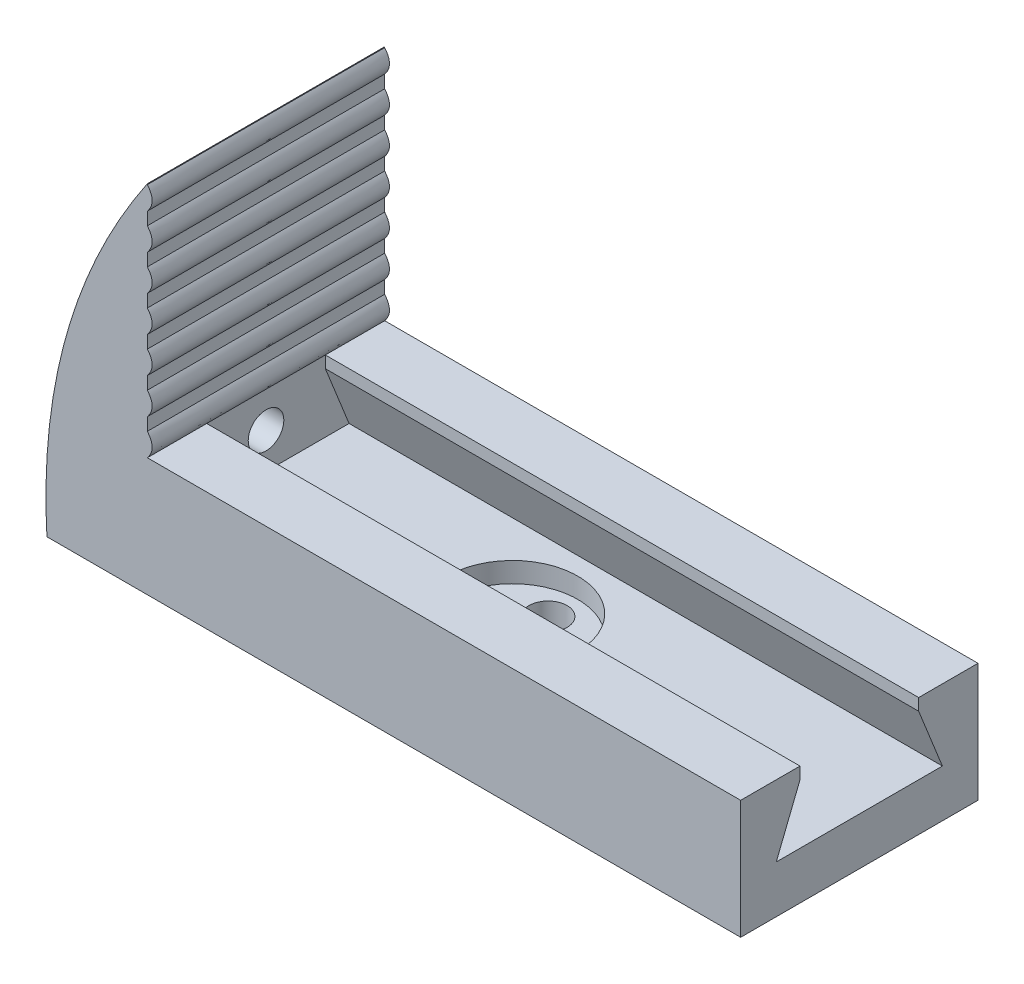
ISO-10303-21;
HEADER;
FILE_DESCRIPTION(('STEP AP214'),'2;1');
FILE_NAME('part.step','',(''),(''),'','','');
FILE_SCHEMA(('AUTOMOTIVE_DESIGN { 1 0 10303 214 1 1 1 1 }'));
ENDSEC;
DATA;
#1=APPLICATION_CONTEXT('core data for automotive mechanical design processes');
#2=APPLICATION_PROTOCOL_DEFINITION('international standard','automotive_design',2000,#1);
#3=PRODUCT_CONTEXT('',#1,'mechanical');
#4=PRODUCT('Part','Part','',(#3));
#5=PRODUCT_RELATED_PRODUCT_CATEGORY('part','',(#4));
#6=PRODUCT_DEFINITION_FORMATION('','',#4);
#7=PRODUCT_DEFINITION_CONTEXT('part definition',#1,'design');
#8=PRODUCT_DEFINITION('design','',#6,#7);
#9=PRODUCT_DEFINITION_SHAPE('','',#8);
#10=(LENGTH_UNIT() NAMED_UNIT(*) SI_UNIT(.MILLI.,.METRE.));
#11=(NAMED_UNIT(*) PLANE_ANGLE_UNIT() SI_UNIT($,.RADIAN.));
#12=(NAMED_UNIT(*) SI_UNIT($,.STERADIAN.) SOLID_ANGLE_UNIT());
#13=UNCERTAINTY_MEASURE_WITH_UNIT(LENGTH_MEASURE(1.E-05),#10,'distance_accuracy_value','');
#14=(GEOMETRIC_REPRESENTATION_CONTEXT(3) GLOBAL_UNCERTAINTY_ASSIGNED_CONTEXT((#13)) GLOBAL_UNIT_ASSIGNED_CONTEXT((#10,
#11,#12)) REPRESENTATION_CONTEXT('',''));
#15=CARTESIAN_POINT('',(0.,0.,0.));
#16=DIRECTION('',(0.,0.,1.));
#17=DIRECTION('',(1.,0.,0.));
#18=AXIS2_PLACEMENT_3D('',#15,#16,#17);
#19=CARTESIAN_POINT('',(-4.23156050298908,13.,3.));
#20=DIRECTION('',(0.,-1.,0.));
#21=DIRECTION('',(0.,0.,-1.));
#22=AXIS2_PLACEMENT_3D('',#19,#20,#21);
#23=CYLINDRICAL_SURFACE('',#22,1.6);
#24=CARTESIAN_POINT('',(-4.23156050298908,0.,3.));
#25=DIRECTION('',(0.,-1.,0.));
#26=DIRECTION('',(0.,0.,-1.));
#27=AXIS2_PLACEMENT_3D('',#24,#25,#26);
#28=CIRCLE('',#27,1.6);
#29=CARTESIAN_POINT('',(-4.23156050298908,0.,1.4));
#30=VERTEX_POINT('',#29);
#31=EDGE_CURVE('E319',#30,#30,#28,.T.);
#32=ORIENTED_EDGE('',*,*,#31,.T.);
#33=EDGE_LOOP('',(#32));
#34=FACE_BOUND('',#33,.T.);
#35=CARTESIAN_POINT('',(-4.23156050298908,2.3,3.));
#36=DIRECTION('',(0.,1.,0.));
#37=DIRECTION('',(0.,0.,1.));
#38=AXIS2_PLACEMENT_3D('',#35,#36,#37);
#39=CIRCLE('',#38,1.6);
#40=CARTESIAN_POINT('',(-4.23156050298908,2.3,4.6));
#41=VERTEX_POINT('',#40);
#42=EDGE_CURVE('E544',#41,#41,#39,.F.);
#43=ORIENTED_EDGE('',*,*,#42,.F.);
#44=EDGE_LOOP('',(#43));
#45=FACE_BOUND('',#44,.T.);
#46=ADVANCED_FACE('F37',(#34,#45),#23,.F.);
#47=CARTESIAN_POINT('',(-7.23156050298908,13.,0.));
#48=DIRECTION('',(0.,-1.,0.));
#49=DIRECTION('',(0.,0.,-1.));
#50=AXIS2_PLACEMENT_3D('',#47,#48,#49);
#51=CYLINDRICAL_SURFACE('',#50,1.6);
#52=CARTESIAN_POINT('',(-7.23156050298908,0.,0.));
#53=DIRECTION('',(0.,-1.,0.));
#54=DIRECTION('',(0.,0.,1.));
#55=AXIS2_PLACEMENT_3D('',#52,#53,#54);
#56=CIRCLE('',#55,1.6);
#57=CARTESIAN_POINT('',(-7.23156050298908,0.,1.6));
#58=VERTEX_POINT('',#57);
#59=EDGE_CURVE('E546',#58,#58,#56,.T.);
#60=ORIENTED_EDGE('',*,*,#59,.T.);
#61=EDGE_LOOP('',(#60));
#62=FACE_BOUND('',#61,.T.);
#63=CARTESIAN_POINT('',(-7.23156050298908,2.3,0.));
#64=DIRECTION('',(0.,1.,0.));
#65=DIRECTION('',(0.,0.,1.));
#66=AXIS2_PLACEMENT_3D('',#63,#64,#65);
#67=CIRCLE('',#66,1.6);
#68=CARTESIAN_POINT('',(-7.23156050298908,2.3,1.6));
#69=VERTEX_POINT('',#68);
#70=EDGE_CURVE('E547',#69,#69,#67,.F.);
#71=ORIENTED_EDGE('',*,*,#70,.F.);
#72=EDGE_LOOP('',(#71));
#73=FACE_BOUND('',#72,.T.);
#74=ADVANCED_FACE('F531',(#62,#73),#51,.F.);
#75=CARTESIAN_POINT('',(-4.23156050298908,13.,-3.00000000000001));
#76=DIRECTION('',(0.,-1.,0.));
#77=DIRECTION('',(0.,0.,-1.));
#78=AXIS2_PLACEMENT_3D('',#75,#76,#77);
#79=CYLINDRICAL_SURFACE('',#78,1.6);
#80=CARTESIAN_POINT('',(-4.23156050298908,0.,-3.00000000000001));
#81=DIRECTION('',(0.,-1.,0.));
#82=DIRECTION('',(0.,0.,1.));
#83=AXIS2_PLACEMENT_3D('',#80,#81,#82);
#84=CIRCLE('',#83,1.6);
#85=CARTESIAN_POINT('',(-4.23156050298908,0.,-1.40000000000001));
#86=VERTEX_POINT('',#85);
#87=EDGE_CURVE('E559',#86,#86,#84,.T.);
#88=ORIENTED_EDGE('',*,*,#87,.T.);
#89=EDGE_LOOP('',(#88));
#90=FACE_BOUND('',#89,.T.);
#91=CARTESIAN_POINT('',(-4.23156050298908,2.3,-3.00000000000001));
#92=DIRECTION('',(0.,1.,0.));
#93=DIRECTION('',(0.,0.,1.));
#94=AXIS2_PLACEMENT_3D('',#91,#92,#93);
#95=CIRCLE('',#94,1.6);
#96=CARTESIAN_POINT('',(-4.23156050298908,2.3,-1.40000000000001));
#97=VERTEX_POINT('',#96);
#98=EDGE_CURVE('E553',#97,#97,#95,.F.);
#99=ORIENTED_EDGE('',*,*,#98,.F.);
#100=EDGE_LOOP('',(#99));
#101=FACE_BOUND('',#100,.T.);
#102=ADVANCED_FACE('F536',(#90,#101),#79,.F.);
#103=CARTESIAN_POINT('',(-1.23156050298907,13.,0.));
#104=DIRECTION('',(0.,-1.,0.));
#105=DIRECTION('',(0.,0.,-1.));
#106=AXIS2_PLACEMENT_3D('',#103,#104,#105);
#107=CYLINDRICAL_SURFACE('',#106,1.6);
#108=CARTESIAN_POINT('',(-1.23156050298907,0.,0.));
#109=DIRECTION('',(0.,-1.,0.));
#110=DIRECTION('',(0.,0.,-1.));
#111=AXIS2_PLACEMENT_3D('',#108,#109,#110);
#112=CIRCLE('',#111,1.6);
#113=CARTESIAN_POINT('',(-1.23156050298907,0.,-1.6));
#114=VERTEX_POINT('',#113);
#115=EDGE_CURVE('E550',#114,#114,#112,.T.);
#116=ORIENTED_EDGE('',*,*,#115,.T.);
#117=EDGE_LOOP('',(#116));
#118=FACE_BOUND('',#117,.T.);
#119=CARTESIAN_POINT('',(-1.23156050298907,2.3,0.));
#120=DIRECTION('',(0.,1.,0.));
#121=DIRECTION('',(0.,0.,1.));
#122=AXIS2_PLACEMENT_3D('',#119,#120,#121);
#123=CIRCLE('',#122,1.6);
#124=CARTESIAN_POINT('',(-1.23156050298907,2.3,1.6));
#125=VERTEX_POINT('',#124);
#126=EDGE_CURVE('E41',#125,#125,#123,.F.);
#127=ORIENTED_EDGE('',*,*,#126,.F.);
#128=EDGE_LOOP('',(#127));
#129=FACE_BOUND('',#128,.T.);
#130=ADVANCED_FACE('F645',(#118,#129),#107,.F.);
#131=CARTESIAN_POINT('',(-25.,30.,-9.99999999999999));
#132=CARTESIAN_POINT('',(-34.3943093471857,16.1499442754286,-9.99999999999999));
#133=CARTESIAN_POINT('',(-33.4631210059781,0.,-9.99999999999999));
#134=B_SPLINE_CURVE_WITH_KNOTS('',2,(#131,#132,#133),.UNSPECIFIED.,.F.,.F.,(3,3),(0.,1.),.UNSPECIFIED.);
#135=DIRECTION('',(0.,0.,1.));
#136=VECTOR('',#135,1.);
#137=SURFACE_OF_LINEAR_EXTRUSION('',#134,#136);
#138=CARTESIAN_POINT('',(-25.,30.,10.));
#139=CARTESIAN_POINT('',(-34.3943093471857,16.1499442754286,10.));
#140=CARTESIAN_POINT('',(-33.4631210059781,0.,10.));
#141=B_SPLINE_CURVE_WITH_KNOTS('',2,(#138,#139,#140),.UNSPECIFIED.,.F.,.F.,(3,3),(0.,1.),.UNSPECIFIED.);
#142=CARTESIAN_POINT('',(-25.,30.,10.));
#143=VERTEX_POINT('',#142);
#144=CARTESIAN_POINT('',(-33.4631210059781,0.,10.));
#145=VERTEX_POINT('',#144);
#146=EDGE_CURVE('E225',#143,#145,#141,.T.);
#147=ORIENTED_EDGE('',*,*,#146,.F.);
#148=DIRECTION('',(0.,0.,1.));
#149=VECTOR('',#148,1.);
#150=CARTESIAN_POINT('',(-25.,30.,-9.99999999999999));
#151=LINE('',#150,#149);
#152=CARTESIAN_POINT('',(-25.,30.,-9.99999999999999));
#153=VERTEX_POINT('',#152);
#154=EDGE_CURVE('E244',#153,#143,#151,.T.);
#155=ORIENTED_EDGE('',*,*,#154,.F.);
#156=CARTESIAN_POINT('',(-33.4631210059781,0.,-9.99999999999999));
#157=VERTEX_POINT('',#156);
#158=EDGE_CURVE('E227',#153,#157,#134,.T.);
#159=ORIENTED_EDGE('',*,*,#158,.T.);
#160=DIRECTION('',(0.,0.,1.));
#161=VECTOR('',#160,1.);
#162=CARTESIAN_POINT('',(-33.4631210059781,0.,-9.99999999999999));
#163=LINE('',#162,#161);
#164=EDGE_CURVE('E237',#157,#145,#163,.T.);
#165=ORIENTED_EDGE('',*,*,#164,.T.);
#166=EDGE_LOOP('',(#147,#155,#159,#165));
#167=FACE_BOUND('',#166,.T.);
#168=CARTESIAN_POINT('',(-33.3726320097017,7.,1.5));
#169=CARTESIAN_POINT('',(-33.3798660882242,6.91568089328607,1.49999673038853));
#170=CARTESIAN_POINT('',(-33.3868757475341,6.83128390302348,1.49286722869916));
#171=CARTESIAN_POINT('',(-33.4002622270393,6.66477082808157,1.46450308822429));
#172=CARTESIAN_POINT('',(-33.4066383026797,6.58265750674469,1.44325207473375));
#173=CARTESIAN_POINT('',(-33.4186251285714,6.42314681296672,1.38722049220531));
#174=CARTESIAN_POINT('',(-33.4242361358155,6.34574786178663,1.35244448152408));
#175=CARTESIAN_POINT('',(-33.4346194485964,6.19788599730386,1.27033985265203));
#176=CARTESIAN_POINT('',(-33.4393919617546,6.12742136888278,1.22301434917541));
#177=CARTESIAN_POINT('',(-33.4480609090173,5.99557957848058,1.11725798364129));
#178=CARTESIAN_POINT('',(-33.451959234821,5.93418289421686,1.05885161606227));
#179=CARTESIAN_POINT('',(-33.4588961463163,5.82205945502125,0.932517662763153));
#180=CARTESIAN_POINT('',(-33.4619347090152,5.77133298545422,0.864589822481163));
#181=CARTESIAN_POINT('',(-33.4671688608163,5.6821147378301,0.721307884473805));
#182=CARTESIAN_POINT('',(-33.4693663155634,5.64359591529021,0.645970693711993));
#183=CARTESIAN_POINT('',(-33.4729572927952,5.57974513506824,0.489883644386686));
#184=CARTESIAN_POINT('',(-33.4743508221476,5.55441306473785,0.409133832067357));
#185=CARTESIAN_POINT('',(-33.476358002982,5.51768264134727,0.24460652431748));
#186=CARTESIAN_POINT('',(-33.4769724847515,5.50626945441649,0.160832350305014));
#187=CARTESIAN_POINT('',(-33.4774370863161,5.4976543683585,-0.00744545299836306));
#188=CARTESIAN_POINT('',(-33.4772872094699,5.50045240678101,-0.0919490790821164));
#189=CARTESIAN_POINT('',(-33.4762200592232,5.52017621021143,-0.259257644764204));
#190=CARTESIAN_POINT('',(-33.475303039982,5.5370972961569,-0.342063137657603));
#191=CARTESIAN_POINT('',(-33.4726836746026,5.58457647616954,-0.503654384382997));
#192=CARTESIAN_POINT('',(-33.4709813285049,5.6151345695341,-0.582440138422096));
#193=CARTESIAN_POINT('',(-33.466763172182,5.68901775292015,-0.733768545490131));
#194=CARTESIAN_POINT('',(-33.4642472485734,5.73234462237442,-0.80631032654891));
#195=CARTESIAN_POINT('',(-33.4583738812554,5.8305225920919,-0.943084936299633));
#196=CARTESIAN_POINT('',(-33.4550164370223,5.88537369952626,-1.00731775982115));
#197=CARTESIAN_POINT('',(-33.4474407136605,6.00507465187854,-1.12570634827153));
#198=CARTESIAN_POINT('',(-33.4432218032095,6.06993182113156,-1.17985466684207));
#199=CARTESIAN_POINT('',(-33.4339326800107,6.20776058791227,-1.27649558549115));
#200=CARTESIAN_POINT('',(-33.4288624615904,6.28073223950793,-1.31898810789891));
#201=CARTESIAN_POINT('',(-33.4179057591771,6.43284348482133,-1.39119871303511));
#202=CARTESIAN_POINT('',(-33.4120178675518,6.51199360968137,-1.42089439620854));
#203=CARTESIAN_POINT('',(-33.3995237628833,6.67409904972966,-1.46658804372891));
#204=CARTESIAN_POINT('',(-33.3929175387775,6.7570544235088,-1.4825857970889));
#205=CARTESIAN_POINT('',(-33.3791098900178,6.9246680882463,-1.50048300860634));
#206=CARTESIAN_POINT('',(-33.371906796951,7.00933061537866,-1.50234150094363));
#207=CARTESIAN_POINT('',(-33.3571194314144,7.17773293324932,-1.49182069052032));
#208=CARTESIAN_POINT('',(-33.3495351510483,7.26147270482885,-1.4794410927006));
#209=CARTESIAN_POINT('',(-33.3342079812667,7.42592392140654,-1.44074485052071));
#210=CARTESIAN_POINT('',(-33.3264646803193,7.50662540364865,-1.41438601953491));
#211=CARTESIAN_POINT('',(-33.3111289210578,7.66245096528077,-1.34844956073671));
#212=CARTESIAN_POINT('',(-33.3035364645124,7.73757497929711,-1.30887177801451));
#213=CARTESIAN_POINT('',(-33.2888073290189,7.88018005017477,-1.21756220490128));
#214=CARTESIAN_POINT('',(-33.2816710618742,7.94765424285515,-1.16581962499645));
#215=CARTESIAN_POINT('',(-33.2681800647176,8.072950000608,-1.05164705824968));
#216=CARTESIAN_POINT('',(-33.2618253250829,8.1307716845333,-0.989217203020951));
#217=CARTESIAN_POINT('',(-33.2502182355396,8.23492489844565,-0.855635025809764));
#218=CARTESIAN_POINT('',(-33.244962539135,8.28129138916701,-0.784510259082462));
#219=CARTESIAN_POINT('',(-33.2357915218088,8.36140757732824,-0.635398953695866));
#220=CARTESIAN_POINT('',(-33.2318761518275,8.39515773656637,-0.557412666319386));
#221=CARTESIAN_POINT('',(-33.225608166627,8.44887715009787,-0.397294525994535));
#222=CARTESIAN_POINT('',(-33.2232462773685,8.46892821424211,-0.315190482950063));
#223=CARTESIAN_POINT('',(-33.2201722679539,8.49498062449431,-0.148753905596939));
#224=CARTESIAN_POINT('',(-33.2194600958629,8.50098241288752,-0.064421441525739));
#225=CARTESIAN_POINT('',(-33.2197230403341,8.49876124234062,0.103641131840759));
#226=CARTESIAN_POINT('',(-33.2206899138187,8.49060777701309,0.187372168855595));
#227=CARTESIAN_POINT('',(-33.2242429212416,8.46045997587938,0.352256516270666));
#228=CARTESIAN_POINT('',(-33.2268290497599,8.43846568640196,0.433409835298223));
#229=CARTESIAN_POINT('',(-33.2334895000029,8.38125085360612,0.59089413981618));
#230=CARTESIAN_POINT('',(-33.2375638687457,8.34602989241646,0.667224972860393));
#231=CARTESIAN_POINT('',(-33.2446277676333,8.28412424533619,0.776390301310688));
#232=CARTESIAN_POINT('',(-33.2471417103995,8.26197143577672,0.811896686793386));
#233=CARTESIAN_POINT('',(-33.2524593407213,8.21476982120149,0.880956746515223));
#234=CARTESIAN_POINT('',(-33.2552632992378,8.18971830529222,0.914508548007757));
#235=CARTESIAN_POINT('',(-33.2640825602406,8.11027586224244,1.0120930477696));
#236=CARTESIAN_POINT('',(-33.270488088118,8.05174575073811,1.07279308237845));
#237=CARTESIAN_POINT('',(-33.2840319559788,7.92540155731558,1.18350665885825));
#238=CARTESIAN_POINT('',(-33.2911703158818,7.85758722301966,1.23351991013028));
#239=CARTESIAN_POINT('',(-33.3022138188797,7.75015574274244,1.29963733631565));
#240=CARTESIAN_POINT('',(-33.3059663813299,7.71323727321814,1.32025592278949));
#241=CARTESIAN_POINT('',(-33.3135359469746,7.63783684734656,1.35828821903117));
#242=CARTESIAN_POINT('',(-33.3173528902725,7.59935630193532,1.37570474572656));
#243=CARTESIAN_POINT('',(-33.3288433751755,7.48196775356049,1.42295436866034));
#244=CARTESIAN_POINT('',(-33.3365686471612,7.40099606249859,1.44785922342357));
#245=CARTESIAN_POINT('',(-33.3490513702518,7.26629105037393,1.47714749926788));
#246=CARTESIAN_POINT('',(-33.3538617938256,7.2134160930531,1.48570423792298));
#247=CARTESIAN_POINT('',(-33.3633556365538,7.10703789009846,1.49713153440378));
#248=CARTESIAN_POINT('',(-33.3680390553433,7.05353464266006,1.50000207589345));
#249=CARTESIAN_POINT('',(-33.3726320097017,7.,1.5));
#250=B_SPLINE_CURVE_WITH_KNOTS('',3,(#168,#169,#170,#171,#172,#173,#174,#175,#176,#177,#178,
#179,#180,#181,#182,#183,#184,#185,#186,#187,#188,#189,#190,#191,#192,#193,#194,#195,#196,#197,
#198,#199,#200,#201,#202,#203,#204,#205,#206,#207,#208,#209,#210,#211,#212,#213,#214,#215,#216,
#217,#218,#219,#220,#221,#222,#223,#224,#225,#226,#227,#228,#229,#230,#231,#232,#233,#234,#235,
#236,#237,#238,#239,#240,#241,#242,#243,#244,#245,#246,#247,#248,#249),.UNSPECIFIED.,.T.,.F.,(4,
2,2,2,2,2,2,2,2,2,2,2,2,2,2,2,2,2,2,2,2,2,2,2,2,2,2,2,2,2,2,2,2,2,2,2,2,2,2,2,4),(0.,
0.253688830627725,0.507672342558801,0.761570327999652,1.01540535626054,1.26868568032101,
1.52197277726447,1.77469476179795,2.02741458740935,2.27986484409422,2.53231399140424,
2.784679533766,3.03704506312531,3.28944577831722,3.54184665057002,3.79443316203447,
4.04702135661994,4.30004990258134,4.55308234582953,4.80684762429409,5.06061816168776,
5.31515892416245,5.5697026696454,5.82447303903683,6.07924027117068,6.33322008385554,
6.58719059915262,6.839630846189,7.09206314604686,7.34325966000962,7.59445533315831,
7.84565894301881,7.97130996004022,8.09707945140546,8.34951155477146,8.60195052149004,
8.72917284454038,8.85628270590581,9.11009475802025,9.27116266310501,9.43223103092562),.UNSPECIFIED.);
#251=CARTESIAN_POINT('',(-33.3726320097017,7.,1.5));
#252=VERTEX_POINT('',#251);
#253=EDGE_CURVE('E311',#252,#252,#250,.T.);
#254=ORIENTED_EDGE('',*,*,#253,.T.);
#255=EDGE_LOOP('',(#254));
#256=FACE_BOUND('',#255,.T.);
#257=ADVANCED_FACE('F320',(#167,#256),#137,.T.);
#258=CARTESIAN_POINT('',(-25.,0.,-9.99999999999999));
#259=DIRECTION('',(1.,0.,0.));
#260=DIRECTION('',(0.,0.,-1.));
#261=AXIS2_PLACEMENT_3D('',#258,#259,#260);
#262=PLANE('',#261);
#263=DIRECTION('',(0.,0.,-1.));
#264=VECTOR('',#263,1.);
#265=CARTESIAN_POINT('',(-24.9999999999999,29.9275214146643,10.));
#266=LINE('',#265,#264);
#267=CARTESIAN_POINT('',(-25.,29.9275214146643,10.));
#268=VERTEX_POINT('',#267);
#269=CARTESIAN_POINT('',(-24.9999999999999,29.9275214146643,-10.));
#270=VERTEX_POINT('',#269);
#271=EDGE_CURVE('E202',#268,#270,#266,.T.);
#272=ORIENTED_EDGE('',*,*,#271,.T.);
#273=DIRECTION('',(0.,1.,0.));
#274=VECTOR('',#273,1.);
#275=CARTESIAN_POINT('',(-25.,0.,-9.99999999999999));
#276=LINE('',#275,#274);
#277=EDGE_CURVE('E236',#270,#153,#276,.T.);
#278=ORIENTED_EDGE('',*,*,#277,.T.);
#279=ORIENTED_EDGE('',*,*,#154,.T.);
#280=DIRECTION('',(0.,1.,0.));
#281=VECTOR('',#280,1.);
#282=CARTESIAN_POINT('',(-25.,0.,10.));
#283=LINE('',#282,#281);
#284=EDGE_CURVE('E217',#268,#143,#283,.T.);
#285=ORIENTED_EDGE('',*,*,#284,.F.);
#286=EDGE_LOOP('',(#272,#278,#279,#285));
#287=FACE_BOUND('',#286,.T.);
#288=ADVANCED_FACE('F634',(#287),#262,.T.);
#289=DIRECTION('',(0.,0.,-1.));
#290=VECTOR('',#289,1.);
#291=CARTESIAN_POINT('',(-24.9999999999999,28.,10.));
#292=LINE('',#291,#290);
#293=CARTESIAN_POINT('',(-24.9999999999999,28.,10.));
#294=VERTEX_POINT('',#293);
#295=CARTESIAN_POINT('',(-24.9999999999999,28.,-10.));
#296=VERTEX_POINT('',#295);
#297=EDGE_CURVE('E199',#294,#296,#292,.T.);
#298=ORIENTED_EDGE('',*,*,#297,.F.);
#299=CARTESIAN_POINT('',(-25.,26.9275214146643,10.));
#300=VERTEX_POINT('',#299);
#301=EDGE_CURVE('E211',#300,#294,#283,.T.);
#302=ORIENTED_EDGE('',*,*,#301,.F.);
#303=DIRECTION('',(0.,0.,-1.));
#304=VECTOR('',#303,1.);
#305=CARTESIAN_POINT('',(-24.9999999999999,26.9275214146643,10.));
#306=LINE('',#305,#304);
#307=CARTESIAN_POINT('',(-24.9999999999999,26.9275214146643,-10.));
#308=VERTEX_POINT('',#307);
#309=EDGE_CURVE('E365',#300,#308,#306,.T.);
#310=ORIENTED_EDGE('',*,*,#309,.T.);
#311=EDGE_CURVE('E213',#308,#296,#276,.T.);
#312=ORIENTED_EDGE('',*,*,#311,.T.);
#313=EDGE_LOOP('',(#298,#302,#310,#312));
#314=FACE_BOUND('',#313,.T.);
#315=ADVANCED_FACE('F209',(#314),#262,.T.);
#316=DIRECTION('',(0.,0.,-1.));
#317=VECTOR('',#316,1.);
#318=CARTESIAN_POINT('',(-24.9999999999999,25.,10.));
#319=LINE('',#318,#317);
#320=CARTESIAN_POINT('',(-24.9999999999999,25.,10.));
#321=VERTEX_POINT('',#320);
#322=CARTESIAN_POINT('',(-24.9999999999999,25.,-10.));
#323=VERTEX_POINT('',#322);
#324=EDGE_CURVE('E357',#321,#323,#319,.T.);
#325=ORIENTED_EDGE('',*,*,#324,.F.);
#326=CARTESIAN_POINT('',(-25.,23.9275214146643,10.));
#327=VERTEX_POINT('',#326);
#328=EDGE_CURVE('E216',#327,#321,#283,.T.);
#329=ORIENTED_EDGE('',*,*,#328,.F.);
#330=DIRECTION('',(0.,0.,-1.));
#331=VECTOR('',#330,1.);
#332=CARTESIAN_POINT('',(-25.,23.9275214146643,10.));
#333=LINE('',#332,#331);
#334=CARTESIAN_POINT('',(-25.,23.9275214146643,-10.));
#335=VERTEX_POINT('',#334);
#336=EDGE_CURVE('E411',#327,#335,#333,.T.);
#337=ORIENTED_EDGE('',*,*,#336,.T.);
#338=EDGE_CURVE('E491',#335,#323,#276,.T.);
#339=ORIENTED_EDGE('',*,*,#338,.T.);
#340=EDGE_LOOP('',(#325,#329,#337,#339));
#341=FACE_BOUND('',#340,.T.);
#342=ADVANCED_FACE('F644',(#341),#262,.T.);
#343=DIRECTION('',(0.,0.,-1.));
#344=VECTOR('',#343,1.);
#345=CARTESIAN_POINT('',(-25.,22.,10.));
#346=LINE('',#345,#344);
#347=CARTESIAN_POINT('',(-25.,22.,10.));
#348=VERTEX_POINT('',#347);
#349=CARTESIAN_POINT('',(-25.,22.,-10.));
#350=VERTEX_POINT('',#349);
#351=EDGE_CURVE('E377',#348,#350,#346,.T.);
#352=ORIENTED_EDGE('',*,*,#351,.F.);
#353=CARTESIAN_POINT('',(-25.,20.9275214146643,10.));
#354=VERTEX_POINT('',#353);
#355=EDGE_CURVE('E219',#354,#348,#283,.T.);
#356=ORIENTED_EDGE('',*,*,#355,.F.);
#357=DIRECTION('',(0.,0.,-1.));
#358=VECTOR('',#357,1.);
#359=CARTESIAN_POINT('',(-25.,20.9275214146643,10.));
#360=LINE('',#359,#358);
#361=CARTESIAN_POINT('',(-25.,20.9275214146643,-10.));
#362=VERTEX_POINT('',#361);
#363=EDGE_CURVE('E412',#354,#362,#360,.T.);
#364=ORIENTED_EDGE('',*,*,#363,.T.);
#365=EDGE_CURVE('E493',#362,#350,#276,.T.);
#366=ORIENTED_EDGE('',*,*,#365,.T.);
#367=EDGE_LOOP('',(#352,#356,#364,#366));
#368=FACE_BOUND('',#367,.T.);
#369=ADVANCED_FACE('F516',(#368),#262,.T.);
#370=DIRECTION('',(0.,0.,-1.));
#371=VECTOR('',#370,1.);
#372=CARTESIAN_POINT('',(-25.,19.,10.));
#373=LINE('',#372,#371);
#374=CARTESIAN_POINT('',(-25.,19.,10.));
#375=VERTEX_POINT('',#374);
#376=CARTESIAN_POINT('',(-25.,19.,-10.));
#377=VERTEX_POINT('',#376);
#378=EDGE_CURVE('E402',#375,#377,#373,.T.);
#379=ORIENTED_EDGE('',*,*,#378,.F.);
#380=CARTESIAN_POINT('',(-25.,17.9275214146643,10.));
#381=VERTEX_POINT('',#380);
#382=EDGE_CURVE('E518',#381,#375,#283,.T.);
#383=ORIENTED_EDGE('',*,*,#382,.F.);
#384=DIRECTION('',(0.,0.,-1.));
#385=VECTOR('',#384,1.);
#386=CARTESIAN_POINT('',(-25.,17.9275214146643,10.));
#387=LINE('',#386,#385);
#388=CARTESIAN_POINT('',(-25.,17.9275214146643,-10.));
#389=VERTEX_POINT('',#388);
#390=EDGE_CURVE('E432',#381,#389,#387,.T.);
#391=ORIENTED_EDGE('',*,*,#390,.T.);
#392=EDGE_CURVE('E487',#389,#377,#276,.T.);
#393=ORIENTED_EDGE('',*,*,#392,.T.);
#394=EDGE_LOOP('',(#379,#383,#391,#393));
#395=FACE_BOUND('',#394,.T.);
#396=ADVANCED_FACE('F506',(#395),#262,.T.);
#397=DIRECTION('',(0.,0.,-1.));
#398=VECTOR('',#397,1.);
#399=CARTESIAN_POINT('',(-25.,16.,10.));
#400=LINE('',#399,#398);
#401=CARTESIAN_POINT('',(-25.,16.,10.));
#402=VERTEX_POINT('',#401);
#403=CARTESIAN_POINT('',(-25.,16.,-10.));
#404=VERTEX_POINT('',#403);
#405=EDGE_CURVE('E424',#402,#404,#400,.T.);
#406=ORIENTED_EDGE('',*,*,#405,.F.);
#407=CARTESIAN_POINT('',(-25.,14.9275214146643,10.));
#408=VERTEX_POINT('',#407);
#409=EDGE_CURVE('E226',#408,#402,#283,.T.);
#410=ORIENTED_EDGE('',*,*,#409,.F.);
#411=DIRECTION('',(0.,0.,-1.));
#412=VECTOR('',#411,1.);
#413=CARTESIAN_POINT('',(-25.,14.9275214146643,10.));
#414=LINE('',#413,#412);
#415=CARTESIAN_POINT('',(-25.,14.9275214146643,-10.));
#416=VERTEX_POINT('',#415);
#417=EDGE_CURVE('E475',#408,#416,#414,.T.);
#418=ORIENTED_EDGE('',*,*,#417,.T.);
#419=EDGE_CURVE('E482',#416,#404,#276,.T.);
#420=ORIENTED_EDGE('',*,*,#419,.T.);
#421=EDGE_LOOP('',(#406,#410,#418,#420));
#422=FACE_BOUND('',#421,.T.);
#423=ADVANCED_FACE('F525',(#422),#262,.T.);
#424=DIRECTION('',(0.,0.,-1.));
#425=VECTOR('',#424,1.);
#426=CARTESIAN_POINT('',(-25.,13.,10.));
#427=LINE('',#426,#425);
#428=CARTESIAN_POINT('',(-25.,13.,10.));
#429=VERTEX_POINT('',#428);
#430=CARTESIAN_POINT('',(-25.,13.,-10.));
#431=VERTEX_POINT('',#430);
#432=EDGE_CURVE('E445',#429,#431,#427,.T.);
#433=ORIENTED_EDGE('',*,*,#432,.F.);
#434=CARTESIAN_POINT('',(-25.,11.9275214146643,10.));
#435=VERTEX_POINT('',#434);
#436=EDGE_CURVE('E221',#435,#429,#283,.T.);
#437=ORIENTED_EDGE('',*,*,#436,.F.);
#438=DIRECTION('',(0.,0.,-1.));
#439=VECTOR('',#438,1.);
#440=CARTESIAN_POINT('',(-25.,11.9275214146643,10.));
#441=LINE('',#440,#439);
#442=CARTESIAN_POINT('',(-25.,11.9275214146643,-10.));
#443=VERTEX_POINT('',#442);
#444=EDGE_CURVE('E220',#435,#443,#441,.T.);
#445=ORIENTED_EDGE('',*,*,#444,.T.);
#446=EDGE_CURVE('E480',#443,#431,#276,.T.);
#447=ORIENTED_EDGE('',*,*,#446,.T.);
#448=EDGE_LOOP('',(#433,#437,#445,#447));
#449=FACE_BOUND('',#448,.T.);
#450=ADVANCED_FACE('F622',(#449),#262,.T.);
#451=CARTESIAN_POINT('',(0.,10.,0.));
#452=DIRECTION('',(0.,-1.,0.));
#453=DIRECTION('',(0.,0.,-1.));
#454=AXIS2_PLACEMENT_3D('',#451,#452,#453);
#455=PLANE('',#454);
#456=DIRECTION('',(0.,0.,1.));
#457=VECTOR('',#456,1.);
#458=CARTESIAN_POINT('',(-25.,10.,10.));
#459=LINE('',#458,#457);
#460=CARTESIAN_POINT('',(-25.,10.,-9.99999999999999));
#461=VERTEX_POINT('',#460);
#462=CARTESIAN_POINT('',(-25.,10.,-5.));
#463=VERTEX_POINT('',#462);
#464=EDGE_CURVE('E299',#461,#463,#459,.T.);
#465=ORIENTED_EDGE('',*,*,#464,.T.);
#466=DIRECTION('',(1.,0.,0.));
#467=VECTOR('',#466,1.);
#468=CARTESIAN_POINT('',(0.,10.,-5.));
#469=LINE('',#468,#467);
#470=CARTESIAN_POINT('',(25.,10.,-5.));
#471=VERTEX_POINT('',#470);
#472=EDGE_CURVE('E250',#463,#471,#469,.T.);
#473=ORIENTED_EDGE('',*,*,#472,.T.);
#474=DIRECTION('',(0.,0.,-1.));
#475=VECTOR('',#474,1.);
#476=CARTESIAN_POINT('',(25.,10.,10.));
#477=LINE('',#476,#475);
#478=CARTESIAN_POINT('',(25.,10.,-10.));
#479=VERTEX_POINT('',#478);
#480=EDGE_CURVE('E290',#471,#479,#477,.T.);
#481=ORIENTED_EDGE('',*,*,#480,.T.);
#482=DIRECTION('',(-1.,0.,0.));
#483=VECTOR('',#482,1.);
#484=CARTESIAN_POINT('',(-25.,10.,-10.));
#485=LINE('',#484,#483);
#486=EDGE_CURVE('E289',#479,#461,#485,.T.);
#487=ORIENTED_EDGE('',*,*,#486,.T.);
#488=EDGE_LOOP('',(#465,#473,#481,#487));
#489=FACE_BOUND('',#488,.T.);
#490=ADVANCED_FACE('F602',(#489),#455,.F.);
#491=CARTESIAN_POINT('',(25.,10.,10.));
#492=DIRECTION('',(-1.,0.,0.));
#493=DIRECTION('',(0.,0.,1.));
#494=AXIS2_PLACEMENT_3D('',#491,#492,#493);
#495=PLANE('',#494);
#496=ORIENTED_EDGE('',*,*,#480,.F.);
#497=DIRECTION('',(0.,-1.,0.));
#498=VECTOR('',#497,1.);
#499=CARTESIAN_POINT('',(25.,10.,-5.));
#500=LINE('',#499,#498);
#501=CARTESIAN_POINT('',(25.,9.,-5.));
#502=VERTEX_POINT('',#501);
#503=EDGE_CURVE('E252',#471,#502,#500,.T.);
#504=ORIENTED_EDGE('',*,*,#503,.T.);
#505=DIRECTION('',(0.,-0.92847669088526,-0.371390676354104));
#506=VECTOR('',#505,1.);
#507=CARTESIAN_POINT('',(25.,15.0344827586207,-2.58620689655173));
#508=LINE('',#507,#506);
#509=CARTESIAN_POINT('',(25.,4.,-7.));
#510=VERTEX_POINT('',#509);
#511=EDGE_CURVE('E268',#502,#510,#508,.T.);
#512=ORIENTED_EDGE('',*,*,#511,.T.);
#513=DIRECTION('',(0.,0.,1.));
#514=VECTOR('',#513,1.);
#515=CARTESIAN_POINT('',(25.,4.,10.));
#516=LINE('',#515,#514);
#517=CARTESIAN_POINT('',(25.,4.,7.));
#518=VERTEX_POINT('',#517);
#519=EDGE_CURVE('E279',#510,#518,#516,.T.);
#520=ORIENTED_EDGE('',*,*,#519,.T.);
#521=DIRECTION('',(0.,0.92847669088526,-0.371390676354104));
#522=VECTOR('',#521,1.);
#523=CARTESIAN_POINT('',(25.,8.13793103448276,5.3448275862069));
#524=LINE('',#523,#522);
#525=CARTESIAN_POINT('',(25.,9.,5.));
#526=VERTEX_POINT('',#525);
#527=EDGE_CURVE('E282',#518,#526,#524,.T.);
#528=ORIENTED_EDGE('',*,*,#527,.T.);
#529=DIRECTION('',(0.,1.,0.));
#530=VECTOR('',#529,1.);
#531=CARTESIAN_POINT('',(25.,10.,5.));
#532=LINE('',#531,#530);
#533=CARTESIAN_POINT('',(25.,10.,5.));
#534=VERTEX_POINT('',#533);
#535=EDGE_CURVE('E247',#526,#534,#532,.T.);
#536=ORIENTED_EDGE('',*,*,#535,.T.);
#537=CARTESIAN_POINT('',(25.,10.,10.));
#538=VERTEX_POINT('',#537);
#539=EDGE_CURVE('E286',#538,#534,#477,.T.);
#540=ORIENTED_EDGE('',*,*,#539,.F.);
#541=DIRECTION('',(0.,-1.,0.));
#542=VECTOR('',#541,1.);
#543=CARTESIAN_POINT('',(25.,10.,10.));
#544=LINE('',#543,#542);
#545=CARTESIAN_POINT('',(25.,0.,10.));
#546=VERTEX_POINT('',#545);
#547=EDGE_CURVE('E587',#538,#546,#544,.T.);
#548=ORIENTED_EDGE('',*,*,#547,.T.);
#549=DIRECTION('',(0.,0.,-1.));
#550=VECTOR('',#549,1.);
#551=CARTESIAN_POINT('',(25.,0.,10.));
#552=LINE('',#551,#550);
#553=CARTESIAN_POINT('',(25.,0.,-10.));
#554=VERTEX_POINT('',#553);
#555=EDGE_CURVE('E285',#546,#554,#552,.T.);
#556=ORIENTED_EDGE('',*,*,#555,.T.);
#557=DIRECTION('',(0.,-1.,0.));
#558=VECTOR('',#557,1.);
#559=CARTESIAN_POINT('',(25.,10.,-10.));
#560=LINE('',#559,#558);
#561=EDGE_CURVE('E46',#479,#554,#560,.T.);
#562=ORIENTED_EDGE('',*,*,#561,.F.);
#563=EDGE_LOOP('',(#496,#504,#512,#520,#528,#536,#540,#548,#556,#562));
#564=FACE_BOUND('',#563,.T.);
#565=ADVANCED_FACE('F39',(#564),#495,.F.);
#566=CARTESIAN_POINT('',(-25.,10.,-10.));
#567=DIRECTION('',(0.,0.,1.));
#568=DIRECTION('',(1.,0.,0.));
#569=AXIS2_PLACEMENT_3D('',#566,#567,#568);
#570=PLANE('',#569);
#571=DIRECTION('',(-1.,0.,0.));
#572=VECTOR('',#571,1.);
#573=CARTESIAN_POINT('',(-25.,0.,-10.));
#574=LINE('',#573,#572);
#575=EDGE_CURVE('E579',#554,#157,#574,.T.);
#576=ORIENTED_EDGE('',*,*,#575,.T.);
#577=ORIENTED_EDGE('',*,*,#158,.F.);
#578=ORIENTED_EDGE('',*,*,#277,.F.);
#579=CARTESIAN_POINT('',(-24.9999999999999,29.9275214146643,-10.));
#580=CARTESIAN_POINT('',(-24.1944289504609,28.9653875182235,-10.));
#581=CARTESIAN_POINT('',(-24.9999999999999,28.,-10.));
#582=B_SPLINE_CURVE_WITH_KNOTS('',2,(#579,#580,#581),.UNSPECIFIED.,.F.,.F.,(3,3),(0.,1.),.UNSPECIFIED.);
#583=EDGE_CURVE('E204',#270,#296,#582,.T.);
#584=ORIENTED_EDGE('',*,*,#583,.T.);
#585=ORIENTED_EDGE('',*,*,#311,.F.);
#586=CARTESIAN_POINT('',(-24.9999999999999,26.9275214146643,-10.));
#587=CARTESIAN_POINT('',(-24.1944289504609,25.9653875182235,-10.));
#588=CARTESIAN_POINT('',(-24.9999999999999,25.,-10.));
#589=B_SPLINE_CURVE_WITH_KNOTS('',2,(#586,#587,#588),.UNSPECIFIED.,.F.,.F.,(3,3),(0.,1.),.UNSPECIFIED.);
#590=EDGE_CURVE('E352',#308,#323,#589,.T.);
#591=ORIENTED_EDGE('',*,*,#590,.T.);
#592=ORIENTED_EDGE('',*,*,#338,.F.);
#593=CARTESIAN_POINT('',(-25.,23.9275214146643,-10.));
#594=CARTESIAN_POINT('',(-24.1944289504609,22.9653875182235,-10.));
#595=CARTESIAN_POINT('',(-25.,22.,-10.));
#596=B_SPLINE_CURVE_WITH_KNOTS('',2,(#593,#594,#595),.UNSPECIFIED.,.F.,.F.,(3,3),(0.,1.),.UNSPECIFIED.);
#597=EDGE_CURVE('E370',#335,#350,#596,.T.);
#598=ORIENTED_EDGE('',*,*,#597,.T.);
#599=ORIENTED_EDGE('',*,*,#365,.F.);
#600=CARTESIAN_POINT('',(-25.,20.9275214146643,-10.));
#601=CARTESIAN_POINT('',(-24.1944289504609,19.9653875182235,-10.));
#602=CARTESIAN_POINT('',(-25.,19.,-10.));
#603=B_SPLINE_CURVE_WITH_KNOTS('',2,(#600,#601,#602),.UNSPECIFIED.,.F.,.F.,(3,3),(0.,1.),.UNSPECIFIED.);
#604=EDGE_CURVE('E403',#362,#377,#603,.T.);
#605=ORIENTED_EDGE('',*,*,#604,.T.);
#606=ORIENTED_EDGE('',*,*,#392,.F.);
#607=CARTESIAN_POINT('',(-25.,17.9275214146643,-10.));
#608=CARTESIAN_POINT('',(-24.194428950461,16.9653875182235,-10.));
#609=CARTESIAN_POINT('',(-25.,16.,-10.));
#610=B_SPLINE_CURVE_WITH_KNOTS('',2,(#607,#608,#609),.UNSPECIFIED.,.F.,.F.,(3,3),(0.,1.),.UNSPECIFIED.);
#611=EDGE_CURVE('E418',#389,#404,#610,.T.);
#612=ORIENTED_EDGE('',*,*,#611,.T.);
#613=ORIENTED_EDGE('',*,*,#419,.F.);
#614=CARTESIAN_POINT('',(-25.,14.9275214146643,-10.));
#615=CARTESIAN_POINT('',(-24.194428950461,13.9653875182235,-10.));
#616=CARTESIAN_POINT('',(-25.,13.,-10.));
#617=B_SPLINE_CURVE_WITH_KNOTS('',2,(#614,#615,#616),.UNSPECIFIED.,.F.,.F.,(3,3),(0.,1.),.UNSPECIFIED.);
#618=EDGE_CURVE('E438',#416,#431,#617,.T.);
#619=ORIENTED_EDGE('',*,*,#618,.T.);
#620=ORIENTED_EDGE('',*,*,#446,.F.);
#621=CARTESIAN_POINT('',(-25.,11.9275214146643,-10.));
#622=CARTESIAN_POINT('',(-24.194428950461,10.9653875182235,-10.));
#623=CARTESIAN_POINT('',(-25.,10.,-10.));
#624=B_SPLINE_CURVE_WITH_KNOTS('',2,(#621,#622,#623),.UNSPECIFIED.,.F.,.F.,(3,3),(0.,1.),.UNSPECIFIED.);
#625=EDGE_CURVE('E467',#443,#461,#624,.T.);
#626=ORIENTED_EDGE('',*,*,#625,.T.);
#627=ORIENTED_EDGE('',*,*,#486,.F.);
#628=ORIENTED_EDGE('',*,*,#561,.T.);
#629=EDGE_LOOP('',(#576,#577,#578,#584,#585,#591,#592,#598,#599,#605,#606,#612,#613,#619,#620,
#626,#627,#628));
#630=FACE_BOUND('',#629,.T.);
#631=ADVANCED_FACE('F511',(#630),#570,.F.);
#632=CARTESIAN_POINT('',(-25.,10.,10.));
#633=DIRECTION('',(0.,0.,-1.));
#634=DIRECTION('',(-1.,0.,0.));
#635=AXIS2_PLACEMENT_3D('',#632,#633,#634);
#636=PLANE('',#635);
#637=DIRECTION('',(1.,0.,0.));
#638=VECTOR('',#637,1.);
#639=CARTESIAN_POINT('',(-25.,0.,10.));
#640=LINE('',#639,#638);
#641=EDGE_CURVE('E578',#145,#546,#640,.T.);
#642=ORIENTED_EDGE('',*,*,#641,.T.);
#643=ORIENTED_EDGE('',*,*,#547,.F.);
#644=DIRECTION('',(1.,0.,0.));
#645=VECTOR('',#644,1.);
#646=CARTESIAN_POINT('',(-25.,10.,10.));
#647=LINE('',#646,#645);
#648=CARTESIAN_POINT('',(-25.,10.,10.));
#649=VERTEX_POINT('',#648);
#650=EDGE_CURVE('E295',#649,#538,#647,.T.);
#651=ORIENTED_EDGE('',*,*,#650,.F.);
#652=CARTESIAN_POINT('',(-25.,11.9275214146643,10.));
#653=CARTESIAN_POINT('',(-24.194428950461,10.9653875182235,10.));
#654=CARTESIAN_POINT('',(-25.,10.,10.));
#655=B_SPLINE_CURVE_WITH_KNOTS('',2,(#652,#653,#654),.UNSPECIFIED.,.F.,.F.,(3,3),(0.,1.),.UNSPECIFIED.);
#656=EDGE_CURVE('E460',#435,#649,#655,.T.);
#657=ORIENTED_EDGE('',*,*,#656,.F.);
#658=ORIENTED_EDGE('',*,*,#436,.T.);
#659=CARTESIAN_POINT('',(-25.,14.9275214146643,10.));
#660=CARTESIAN_POINT('',(-24.194428950461,13.9653875182235,10.));
#661=CARTESIAN_POINT('',(-25.,13.,10.));
#662=B_SPLINE_CURVE_WITH_KNOTS('',2,(#659,#660,#661),.UNSPECIFIED.,.F.,.F.,(3,3),(0.,1.),.UNSPECIFIED.);
#663=EDGE_CURVE('E440',#408,#429,#662,.T.);
#664=ORIENTED_EDGE('',*,*,#663,.F.);
#665=ORIENTED_EDGE('',*,*,#409,.T.);
#666=CARTESIAN_POINT('',(-25.,17.9275214146643,10.));
#667=CARTESIAN_POINT('',(-24.194428950461,16.9653875182235,10.));
#668=CARTESIAN_POINT('',(-25.,16.,10.));
#669=B_SPLINE_CURVE_WITH_KNOTS('',2,(#666,#667,#668),.UNSPECIFIED.,.F.,.F.,(3,3),(0.,1.),.UNSPECIFIED.);
#670=EDGE_CURVE('E419',#381,#402,#669,.T.);
#671=ORIENTED_EDGE('',*,*,#670,.F.);
#672=ORIENTED_EDGE('',*,*,#382,.T.);
#673=CARTESIAN_POINT('',(-25.,20.9275214146643,10.));
#674=CARTESIAN_POINT('',(-24.1944289504609,19.9653875182235,10.));
#675=CARTESIAN_POINT('',(-25.,19.,10.));
#676=B_SPLINE_CURVE_WITH_KNOTS('',2,(#673,#674,#675),.UNSPECIFIED.,.F.,.F.,(3,3),(0.,1.),.UNSPECIFIED.);
#677=EDGE_CURVE('E396',#354,#375,#676,.T.);
#678=ORIENTED_EDGE('',*,*,#677,.F.);
#679=ORIENTED_EDGE('',*,*,#355,.T.);
#680=CARTESIAN_POINT('',(-25.,23.9275214146643,10.));
#681=CARTESIAN_POINT('',(-24.1944289504609,22.9653875182235,10.));
#682=CARTESIAN_POINT('',(-25.,22.,10.));
#683=B_SPLINE_CURVE_WITH_KNOTS('',2,(#680,#681,#682),.UNSPECIFIED.,.F.,.F.,(3,3),(0.,1.),.UNSPECIFIED.);
#684=EDGE_CURVE('E372',#327,#348,#683,.T.);
#685=ORIENTED_EDGE('',*,*,#684,.F.);
#686=ORIENTED_EDGE('',*,*,#328,.T.);
#687=CARTESIAN_POINT('',(-24.9999999999999,26.9275214146643,10.));
#688=CARTESIAN_POINT('',(-24.1944289504609,25.9653875182235,10.));
#689=CARTESIAN_POINT('',(-24.9999999999999,25.,10.));
#690=B_SPLINE_CURVE_WITH_KNOTS('',2,(#687,#688,#689),.UNSPECIFIED.,.F.,.F.,(3,3),(0.,1.),.UNSPECIFIED.);
#691=EDGE_CURVE('E60',#300,#321,#690,.T.);
#692=ORIENTED_EDGE('',*,*,#691,.F.);
#693=ORIENTED_EDGE('',*,*,#301,.T.);
#694=CARTESIAN_POINT('',(-24.9999999999999,29.9275214146643,10.));
#695=CARTESIAN_POINT('',(-24.1944289504609,28.9653875182235,10.));
#696=CARTESIAN_POINT('',(-24.9999999999999,28.,10.));
#697=B_SPLINE_CURVE_WITH_KNOTS('',2,(#694,#695,#696),.UNSPECIFIED.,.F.,.F.,(3,3),(0.,1.),.UNSPECIFIED.);
#698=EDGE_CURVE('E54',#268,#294,#697,.T.);
#699=ORIENTED_EDGE('',*,*,#698,.F.);
#700=ORIENTED_EDGE('',*,*,#284,.T.);
#701=ORIENTED_EDGE('',*,*,#146,.T.);
#702=EDGE_LOOP('',(#642,#643,#651,#657,#658,#664,#665,#671,#672,#678,#679,#685,#686,#692,#693,
#699,#700,#701));
#703=FACE_BOUND('',#702,.T.);
#704=ADVANCED_FACE('F215',(#703),#636,.F.);
#705=ORIENTED_EDGE('',*,*,#539,.T.);
#706=DIRECTION('',(-1.,0.,0.));
#707=VECTOR('',#706,1.);
#708=CARTESIAN_POINT('',(0.,10.,5.));
#709=LINE('',#708,#707);
#710=CARTESIAN_POINT('',(-25.,10.,5.));
#711=VERTEX_POINT('',#710);
#712=EDGE_CURVE('E251',#534,#711,#709,.T.);
#713=ORIENTED_EDGE('',*,*,#712,.T.);
#714=EDGE_CURVE('E292',#711,#649,#459,.T.);
#715=ORIENTED_EDGE('',*,*,#714,.T.);
#716=ORIENTED_EDGE('',*,*,#650,.T.);
#717=EDGE_LOOP('',(#705,#713,#715,#716));
#718=FACE_BOUND('',#717,.T.);
#719=ADVANCED_FACE('F569',(#718),#455,.F.);
#720=CARTESIAN_POINT('',(0.,0.,0.));
#721=DIRECTION('',(0.,-1.,0.));
#722=DIRECTION('',(0.,0.,-1.));
#723=AXIS2_PLACEMENT_3D('',#720,#721,#722);
#724=PLANE('',#723);
#725=ORIENTED_EDGE('',*,*,#115,.F.);
#726=EDGE_LOOP('',(#725));
#727=FACE_BOUND('',#726,.T.);
#728=ORIENTED_EDGE('',*,*,#87,.F.);
#729=EDGE_LOOP('',(#728));
#730=FACE_BOUND('',#729,.T.);
#731=ORIENTED_EDGE('',*,*,#59,.F.);
#732=EDGE_LOOP('',(#731));
#733=FACE_BOUND('',#732,.T.);
#734=ORIENTED_EDGE('',*,*,#31,.F.);
#735=EDGE_LOOP('',(#734));
#736=FACE_BOUND('',#735,.T.);
#737=ORIENTED_EDGE('',*,*,#555,.F.);
#738=ORIENTED_EDGE('',*,*,#641,.F.);
#739=ORIENTED_EDGE('',*,*,#164,.F.);
#740=ORIENTED_EDGE('',*,*,#575,.F.);
#741=EDGE_LOOP('',(#737,#738,#739,#740));
#742=FACE_BOUND('',#741,.T.);
#743=ADVANCED_FACE('F565',(#727,#730,#733,#736,#742),#724,.T.);
#744=CARTESIAN_POINT('',(32.,9.,5.));
#745=DIRECTION('',(0.,0.371390676354104,0.928476690885259));
#746=DIRECTION('',(0.,-0.92847669088526,0.371390676354104));
#747=AXIS2_PLACEMENT_3D('',#744,#745,#746);
#748=PLANE('',#747);
#749=DIRECTION('',(-1.,0.,0.));
#750=VECTOR('',#749,1.);
#751=CARTESIAN_POINT('',(32.,4.,7.));
#752=LINE('',#751,#750);
#753=CARTESIAN_POINT('',(-25.,4.,7.));
#754=VERTEX_POINT('',#753);
#755=EDGE_CURVE('E265',#518,#754,#752,.T.);
#756=ORIENTED_EDGE('',*,*,#755,.T.);
#757=DIRECTION('',(0.,0.928476690885259,-0.371390676354104));
#758=VECTOR('',#757,1.);
#759=CARTESIAN_POINT('',(-25.,9.,5.));
#760=LINE('',#759,#758);
#761=CARTESIAN_POINT('',(-25.,9.,5.));
#762=VERTEX_POINT('',#761);
#763=EDGE_CURVE('E255',#754,#762,#760,.T.);
#764=ORIENTED_EDGE('',*,*,#763,.T.);
#765=DIRECTION('',(-1.,0.,0.));
#766=VECTOR('',#765,1.);
#767=CARTESIAN_POINT('',(32.,9.,5.));
#768=LINE('',#767,#766);
#769=EDGE_CURVE('E264',#526,#762,#768,.T.);
#770=ORIENTED_EDGE('',*,*,#769,.F.);
#771=ORIENTED_EDGE('',*,*,#527,.F.);
#772=EDGE_LOOP('',(#756,#764,#770,#771));
#773=FACE_BOUND('',#772,.T.);
#774=ADVANCED_FACE('F568',(#773),#748,.F.);
#775=CARTESIAN_POINT('',(32.,4.,7.));
#776=DIRECTION('',(0.,-1.,0.));
#777=DIRECTION('',(0.,0.,-1.));
#778=AXIS2_PLACEMENT_3D('',#775,#776,#777);
#779=PLANE('',#778);
#780=CARTESIAN_POINT('',(-4.23156050298908,4.,0.));
#781=DIRECTION('',(0.,1.,0.));
#782=DIRECTION('',(0.,0.,1.));
#783=AXIS2_PLACEMENT_3D('',#780,#781,#782);
#784=CIRCLE('',#783,5.5);
#785=CARTESIAN_POINT('',(-4.23156050298908,4.,5.5));
#786=VERTEX_POINT('',#785);
#787=EDGE_CURVE('E855',#786,#786,#784,.T.);
#788=ORIENTED_EDGE('',*,*,#787,.F.);
#789=EDGE_LOOP('',(#788));
#790=FACE_BOUND('',#789,.T.);
#791=DIRECTION('',(-1.,0.,0.));
#792=VECTOR('',#791,1.);
#793=CARTESIAN_POINT('',(32.,4.,-7.));
#794=LINE('',#793,#792);
#795=CARTESIAN_POINT('',(-25.,4.,-7.));
#796=VERTEX_POINT('',#795);
#797=EDGE_CURVE('E269',#510,#796,#794,.T.);
#798=ORIENTED_EDGE('',*,*,#797,.T.);
#799=DIRECTION('',(0.,0.,1.));
#800=VECTOR('',#799,1.);
#801=CARTESIAN_POINT('',(-25.,4.,7.));
#802=LINE('',#801,#800);
#803=EDGE_CURVE('E261',#796,#754,#802,.T.);
#804=ORIENTED_EDGE('',*,*,#803,.T.);
#805=ORIENTED_EDGE('',*,*,#755,.F.);
#806=ORIENTED_EDGE('',*,*,#519,.F.);
#807=EDGE_LOOP('',(#798,#804,#805,#806));
#808=FACE_BOUND('',#807,.T.);
#809=ADVANCED_FACE('F822',(#790,#808),#779,.F.);
#810=CARTESIAN_POINT('',(32.,9.,-5.));
#811=DIRECTION('',(0.,0.371390676354104,-0.928476690885259));
#812=DIRECTION('',(0.,0.92847669088526,0.371390676354104));
#813=AXIS2_PLACEMENT_3D('',#810,#811,#812);
#814=PLANE('',#813);
#815=DIRECTION('',(-1.,0.,0.));
#816=VECTOR('',#815,1.);
#817=CARTESIAN_POINT('',(32.,9.,-5.));
#818=LINE('',#817,#816);
#819=CARTESIAN_POINT('',(-25.,9.,-5.));
#820=VERTEX_POINT('',#819);
#821=EDGE_CURVE('E272',#502,#820,#818,.T.);
#822=ORIENTED_EDGE('',*,*,#821,.T.);
#823=DIRECTION('',(0.,-0.928476690885259,-0.371390676354104));
#824=VECTOR('',#823,1.);
#825=CARTESIAN_POINT('',(-25.,9.,-5.));
#826=LINE('',#825,#824);
#827=EDGE_CURVE('E258',#820,#796,#826,.T.);
#828=ORIENTED_EDGE('',*,*,#827,.T.);
#829=ORIENTED_EDGE('',*,*,#797,.F.);
#830=ORIENTED_EDGE('',*,*,#511,.F.);
#831=EDGE_LOOP('',(#822,#828,#829,#830));
#832=FACE_BOUND('',#831,.T.);
#833=ADVANCED_FACE('F717',(#832),#814,.F.);
#834=CARTESIAN_POINT('',(32.,9.,5.));
#835=DIRECTION('',(0.,0.,1.));
#836=DIRECTION('',(1.,0.,0.));
#837=AXIS2_PLACEMENT_3D('',#834,#835,#836);
#838=PLANE('',#837);
#839=ORIENTED_EDGE('',*,*,#769,.T.);
#840=DIRECTION('',(0.,1.,0.));
#841=VECTOR('',#840,1.);
#842=CARTESIAN_POINT('',(-25.,9.,5.));
#843=LINE('',#842,#841);
#844=EDGE_CURVE('E243',#762,#711,#843,.T.);
#845=ORIENTED_EDGE('',*,*,#844,.T.);
#846=ORIENTED_EDGE('',*,*,#712,.F.);
#847=ORIENTED_EDGE('',*,*,#535,.F.);
#848=EDGE_LOOP('',(#839,#845,#846,#847));
#849=FACE_BOUND('',#848,.T.);
#850=ADVANCED_FACE('F618',(#849),#838,.F.);
#851=CARTESIAN_POINT('',(32.,9.,-5.));
#852=DIRECTION('',(0.,0.,-1.));
#853=DIRECTION('',(-1.,0.,0.));
#854=AXIS2_PLACEMENT_3D('',#851,#852,#853);
#855=PLANE('',#854);
#856=ORIENTED_EDGE('',*,*,#472,.F.);
#857=DIRECTION('',(0.,-1.,0.));
#858=VECTOR('',#857,1.);
#859=CARTESIAN_POINT('',(-25.,9.,-5.));
#860=LINE('',#859,#858);
#861=EDGE_CURVE('E305',#463,#820,#860,.T.);
#862=ORIENTED_EDGE('',*,*,#861,.T.);
#863=ORIENTED_EDGE('',*,*,#821,.F.);
#864=ORIENTED_EDGE('',*,*,#503,.F.);
#865=EDGE_LOOP('',(#856,#862,#863,#864));
#866=FACE_BOUND('',#865,.T.);
#867=ADVANCED_FACE('F632',(#866),#855,.F.);
#868=CARTESIAN_POINT('',(-25.,7.,0.));
#869=DIRECTION('',(1.,0.,0.));
#870=DIRECTION('',(0.,0.,-1.));
#871=AXIS2_PLACEMENT_3D('',#868,#869,#870);
#872=CIRCLE('',#871,1.5);
#873=CARTESIAN_POINT('',(-25.,7.,-1.5));
#874=VERTEX_POINT('',#873);
#875=EDGE_CURVE('E318',#874,#874,#872,.F.);
#876=ORIENTED_EDGE('',*,*,#875,.T.);
#877=EDGE_LOOP('',(#876));
#878=FACE_BOUND('',#877,.T.);
#879=DIRECTION('',(0.,0.,-1.));
#880=VECTOR('',#879,1.);
#881=CARTESIAN_POINT('',(-25.,10.,10.));
#882=LINE('',#881,#880);
#883=EDGE_CURVE('E11',#711,#463,#882,.T.);
#884=ORIENTED_EDGE('',*,*,#883,.F.);
#885=ORIENTED_EDGE('',*,*,#844,.F.);
#886=ORIENTED_EDGE('',*,*,#763,.F.);
#887=ORIENTED_EDGE('',*,*,#803,.F.);
#888=ORIENTED_EDGE('',*,*,#827,.F.);
#889=ORIENTED_EDGE('',*,*,#861,.F.);
#890=EDGE_LOOP('',(#884,#885,#886,#887,#888,#889));
#891=FACE_BOUND('',#890,.T.);
#892=ADVANCED_FACE('F458',(#878,#891),#262,.T.);
#893=DIRECTION('',(0.,0.,-1.));
#894=VECTOR('',#893,1.);
#895=SURFACE_OF_LINEAR_EXTRUSION('',#655,#894);
#896=ORIENTED_EDGE('',*,*,#625,.F.);
#897=ORIENTED_EDGE('',*,*,#444,.F.);
#898=ORIENTED_EDGE('',*,*,#656,.T.);
#899=ORIENTED_EDGE('',*,*,#714,.F.);
#900=ORIENTED_EDGE('',*,*,#883,.T.);
#901=ORIENTED_EDGE('',*,*,#464,.F.);
#902=EDGE_LOOP('',(#896,#897,#898,#899,#900,#901));
#903=FACE_BOUND('',#902,.T.);
#904=ADVANCED_FACE('F454',(#903),#895,.T.);
#905=DIRECTION('',(0.,0.,-1.));
#906=VECTOR('',#905,1.);
#907=SURFACE_OF_LINEAR_EXTRUSION('',#662,#906);
#908=ORIENTED_EDGE('',*,*,#618,.F.);
#909=ORIENTED_EDGE('',*,*,#417,.F.);
#910=ORIENTED_EDGE('',*,*,#663,.T.);
#911=ORIENTED_EDGE('',*,*,#432,.T.);
#912=EDGE_LOOP('',(#908,#909,#910,#911));
#913=FACE_BOUND('',#912,.T.);
#914=ADVANCED_FACE('F452',(#913),#907,.T.);
#915=DIRECTION('',(0.,0.,-1.));
#916=VECTOR('',#915,1.);
#917=SURFACE_OF_LINEAR_EXTRUSION('',#669,#916);
#918=ORIENTED_EDGE('',*,*,#611,.F.);
#919=ORIENTED_EDGE('',*,*,#390,.F.);
#920=ORIENTED_EDGE('',*,*,#670,.T.);
#921=ORIENTED_EDGE('',*,*,#405,.T.);
#922=EDGE_LOOP('',(#918,#919,#920,#921));
#923=FACE_BOUND('',#922,.T.);
#924=ADVANCED_FACE('F392',(#923),#917,.T.);
#925=DIRECTION('',(0.,0.,-1.));
#926=VECTOR('',#925,1.);
#927=SURFACE_OF_LINEAR_EXTRUSION('',#676,#926);
#928=ORIENTED_EDGE('',*,*,#604,.F.);
#929=ORIENTED_EDGE('',*,*,#363,.F.);
#930=ORIENTED_EDGE('',*,*,#677,.T.);
#931=ORIENTED_EDGE('',*,*,#378,.T.);
#932=EDGE_LOOP('',(#928,#929,#930,#931));
#933=FACE_BOUND('',#932,.T.);
#934=ADVANCED_FACE('F387',(#933),#927,.T.);
#935=DIRECTION('',(0.,0.,-1.));
#936=VECTOR('',#935,1.);
#937=SURFACE_OF_LINEAR_EXTRUSION('',#683,#936);
#938=ORIENTED_EDGE('',*,*,#597,.F.);
#939=ORIENTED_EDGE('',*,*,#336,.F.);
#940=ORIENTED_EDGE('',*,*,#684,.T.);
#941=ORIENTED_EDGE('',*,*,#351,.T.);
#942=EDGE_LOOP('',(#938,#939,#940,#941));
#943=FACE_BOUND('',#942,.T.);
#944=ADVANCED_FACE('F384',(#943),#937,.T.);
#945=DIRECTION('',(0.,0.,-1.));
#946=VECTOR('',#945,1.);
#947=SURFACE_OF_LINEAR_EXTRUSION('',#690,#946);
#948=ORIENTED_EDGE('',*,*,#590,.F.);
#949=ORIENTED_EDGE('',*,*,#309,.F.);
#950=ORIENTED_EDGE('',*,*,#691,.T.);
#951=ORIENTED_EDGE('',*,*,#324,.T.);
#952=EDGE_LOOP('',(#948,#949,#950,#951));
#953=FACE_BOUND('',#952,.T.);
#954=ADVANCED_FACE('F334',(#953),#947,.T.);
#955=DIRECTION('',(0.,0.,-1.));
#956=VECTOR('',#955,1.);
#957=SURFACE_OF_LINEAR_EXTRUSION('',#697,#956);
#958=ORIENTED_EDGE('',*,*,#583,.F.);
#959=ORIENTED_EDGE('',*,*,#271,.F.);
#960=ORIENTED_EDGE('',*,*,#698,.T.);
#961=ORIENTED_EDGE('',*,*,#297,.T.);
#962=EDGE_LOOP('',(#958,#959,#960,#961));
#963=FACE_BOUND('',#962,.T.);
#964=ADVANCED_FACE('F198',(#963),#957,.T.);
#965=CARTESIAN_POINT('',(-22.,7.,0.));
#966=DIRECTION('',(-1.,0.,0.));
#967=DIRECTION('',(0.,0.,1.));
#968=AXIS2_PLACEMENT_3D('',#965,#966,#967);
#969=CYLINDRICAL_SURFACE('',#968,1.5);
#970=ORIENTED_EDGE('',*,*,#875,.F.);
#971=EDGE_LOOP('',(#970));
#972=FACE_BOUND('',#971,.T.);
#973=ORIENTED_EDGE('',*,*,#253,.F.);
#974=EDGE_LOOP('',(#973));
#975=FACE_BOUND('',#974,.T.);
#976=ADVANCED_FACE('F324',(#972,#975),#969,.F.);
#977=CARTESIAN_POINT('',(-4.23156050298908,2.3,0.));
#978=DIRECTION('',(0.,1.,0.));
#979=DIRECTION('',(0.,0.,1.));
#980=AXIS2_PLACEMENT_3D('',#977,#978,#979);
#981=PLANE('',#980);
#982=CARTESIAN_POINT('',(-4.23156050298908,2.3,0.));
#983=DIRECTION('',(0.,1.,0.));
#984=DIRECTION('',(0.,0.,1.));
#985=AXIS2_PLACEMENT_3D('',#982,#983,#984);
#986=CIRCLE('',#985,5.5);
#987=CARTESIAN_POINT('',(-4.23156050298908,2.3,5.5));
#988=VERTEX_POINT('',#987);
#989=EDGE_CURVE('E852',#988,#988,#986,.T.);
#990=ORIENTED_EDGE('',*,*,#989,.T.);
#991=EDGE_LOOP('',(#990));
#992=FACE_BOUND('',#991,.T.);
#993=ORIENTED_EDGE('',*,*,#126,.T.);
#994=EDGE_LOOP('',(#993));
#995=FACE_BOUND('',#994,.T.);
#996=ORIENTED_EDGE('',*,*,#98,.T.);
#997=EDGE_LOOP('',(#996));
#998=FACE_BOUND('',#997,.T.);
#999=ORIENTED_EDGE('',*,*,#70,.T.);
#1000=EDGE_LOOP('',(#999));
#1001=FACE_BOUND('',#1000,.T.);
#1002=ORIENTED_EDGE('',*,*,#42,.T.);
#1003=EDGE_LOOP('',(#1002));
#1004=FACE_BOUND('',#1003,.T.);
#1005=ADVANCED_FACE('F329',(#992,#995,#998,#1001,#1004),#981,.T.);
#1006=CARTESIAN_POINT('',(-4.23156050298908,2.3,0.));
#1007=DIRECTION('',(0.,1.,0.));
#1008=DIRECTION('',(0.,0.,1.));
#1009=AXIS2_PLACEMENT_3D('',#1006,#1007,#1008);
#1010=CYLINDRICAL_SURFACE('',#1009,5.5);
#1011=ORIENTED_EDGE('',*,*,#989,.F.);
#1012=EDGE_LOOP('',(#1011));
#1013=FACE_BOUND('',#1012,.T.);
#1014=ORIENTED_EDGE('',*,*,#787,.T.);
#1015=EDGE_LOOP('',(#1014));
#1016=FACE_BOUND('',#1015,.T.);
#1017=ADVANCED_FACE('F835',(#1013,#1016),#1010,.F.);
#1018=CLOSED_SHELL('',(#46,#74,#102,#130,#257,#288,#315,#342,#369,#396,#423,#450,#490,#565,#631,
#704,#719,#743,#774,#809,#833,#850,#867,#892,#904,#914,#924,#934,#944,#954,#964,#976,#1005,#1017));
#1019=MANIFOLD_SOLID_BREP('B2',#1018);
#1020=ADVANCED_BREP_SHAPE_REPRESENTATION('',(#18,#1019),#14);
#1021=SHAPE_DEFINITION_REPRESENTATION(#9,#1020);
ENDSEC;
END-ISO-10303-21;
